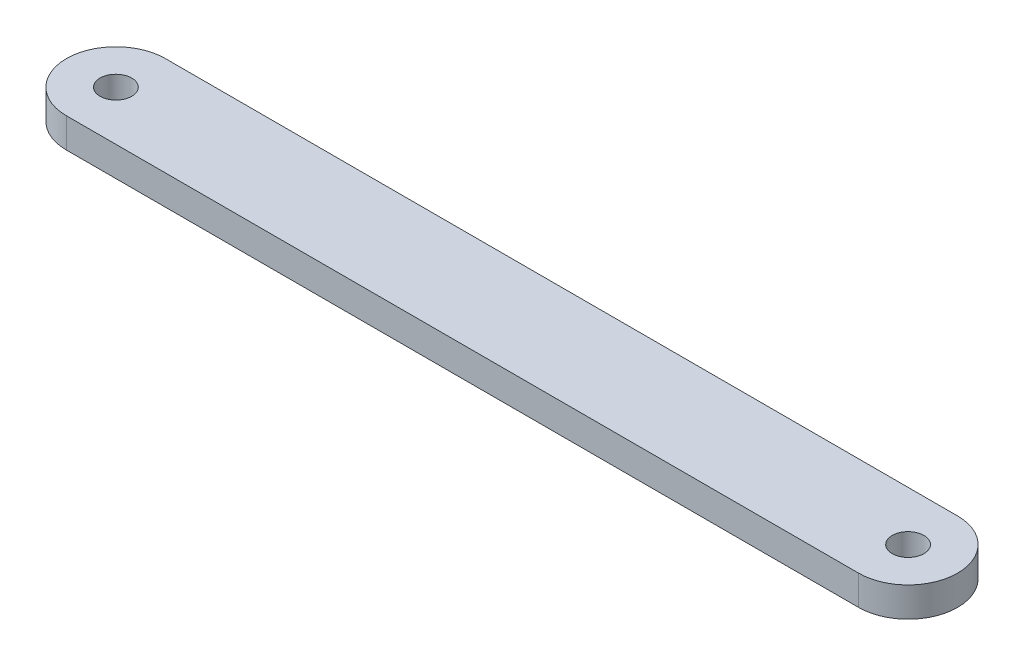
ISO-10303-21;
HEADER;
FILE_DESCRIPTION(('STEP AP214'),'2;1');
FILE_NAME('part.step','',(''),(''),'','','');
FILE_SCHEMA(('AUTOMOTIVE_DESIGN { 1 0 10303 214 1 1 1 1 }'));
ENDSEC;
DATA;
#1=APPLICATION_CONTEXT('core data for automotive mechanical design processes');
#2=APPLICATION_PROTOCOL_DEFINITION('international standard','automotive_design',2000,#1);
#3=PRODUCT_CONTEXT('',#1,'mechanical');
#4=PRODUCT('Part','Part','',(#3));
#5=PRODUCT_RELATED_PRODUCT_CATEGORY('part','',(#4));
#6=PRODUCT_DEFINITION_FORMATION('','',#4);
#7=PRODUCT_DEFINITION_CONTEXT('part definition',#1,'design');
#8=PRODUCT_DEFINITION('design','',#6,#7);
#9=PRODUCT_DEFINITION_SHAPE('','',#8);
#10=(LENGTH_UNIT() NAMED_UNIT(*) SI_UNIT(.MILLI.,.METRE.));
#11=(NAMED_UNIT(*) PLANE_ANGLE_UNIT() SI_UNIT($,.RADIAN.));
#12=(NAMED_UNIT(*) SI_UNIT($,.STERADIAN.) SOLID_ANGLE_UNIT());
#13=UNCERTAINTY_MEASURE_WITH_UNIT(LENGTH_MEASURE(1.E-05),#10,'distance_accuracy_value','');
#14=(GEOMETRIC_REPRESENTATION_CONTEXT(3) GLOBAL_UNCERTAINTY_ASSIGNED_CONTEXT((#13)) GLOBAL_UNIT_ASSIGNED_CONTEXT((#10,
#11,#12)) REPRESENTATION_CONTEXT('',''));
#15=CARTESIAN_POINT('',(0.,0.,0.));
#16=DIRECTION('',(0.,0.,1.));
#17=DIRECTION('',(1.,0.,0.));
#18=AXIS2_PLACEMENT_3D('',#15,#16,#17);
#19=CARTESIAN_POINT('',(80.,3.,0.));
#20=DIRECTION('',(0.,1.,0.));
#21=DIRECTION('',(0.,0.,1.));
#22=AXIS2_PLACEMENT_3D('',#19,#20,#21);
#23=PLANE('',#22);
#24=CARTESIAN_POINT('',(0.,3.,0.));
#25=DIRECTION('',(0.,1.,0.));
#26=DIRECTION('',(0.,0.,1.));
#27=AXIS2_PLACEMENT_3D('',#24,#25,#26);
#28=CIRCLE('',#27,1.6);
#29=CARTESIAN_POINT('',(0.,3.,1.6));
#30=VERTEX_POINT('',#29);
#31=EDGE_CURVE('E112',#30,#30,#28,.T.);
#32=ORIENTED_EDGE('',*,*,#31,.F.);
#33=EDGE_LOOP('',(#32));
#34=FACE_BOUND('',#33,.T.);
#35=CARTESIAN_POINT('',(80.,3.,0.));
#36=DIRECTION('',(0.,1.,0.));
#37=DIRECTION('',(0.,0.,1.));
#38=AXIS2_PLACEMENT_3D('',#35,#36,#37);
#39=CIRCLE('',#38,5.);
#40=CARTESIAN_POINT('',(80.,3.,5.));
#41=VERTEX_POINT('',#40);
#42=CARTESIAN_POINT('',(80.,3.,-5.));
#43=VERTEX_POINT('',#42);
#44=EDGE_CURVE('E92',#41,#43,#39,.T.);
#45=ORIENTED_EDGE('',*,*,#44,.T.);
#46=DIRECTION('',(-1.,0.,0.));
#47=VECTOR('',#46,1.);
#48=CARTESIAN_POINT('',(0.,3.,-5.));
#49=LINE('',#48,#47);
#50=CARTESIAN_POINT('',(0.,3.,-5.));
#51=VERTEX_POINT('',#50);
#52=EDGE_CURVE('E87',#43,#51,#49,.T.);
#53=ORIENTED_EDGE('',*,*,#52,.T.);
#54=CARTESIAN_POINT('',(0.,3.,0.));
#55=DIRECTION('',(0.,1.,0.));
#56=DIRECTION('',(0.,0.,1.));
#57=AXIS2_PLACEMENT_3D('',#54,#55,#56);
#58=CIRCLE('',#57,5.);
#59=CARTESIAN_POINT('',(0.,3.,5.));
#60=VERTEX_POINT('',#59);
#61=EDGE_CURVE('E90',#51,#60,#58,.T.);
#62=ORIENTED_EDGE('',*,*,#61,.T.);
#63=DIRECTION('',(1.,0.,0.));
#64=VECTOR('',#63,1.);
#65=CARTESIAN_POINT('',(0.,3.,5.));
#66=LINE('',#65,#64);
#67=EDGE_CURVE('E57',#60,#41,#66,.T.);
#68=ORIENTED_EDGE('',*,*,#67,.T.);
#69=EDGE_LOOP('',(#45,#53,#62,#68));
#70=FACE_BOUND('',#69,.T.);
#71=CARTESIAN_POINT('',(80.,3.,0.));
#72=DIRECTION('',(0.,1.,0.));
#73=DIRECTION('',(0.,0.,1.));
#74=AXIS2_PLACEMENT_3D('',#71,#72,#73);
#75=CIRCLE('',#74,1.60000000000001);
#76=CARTESIAN_POINT('',(80.,3.,1.60000000000001));
#77=VERTEX_POINT('',#76);
#78=EDGE_CURVE('E134',#77,#77,#75,.T.);
#79=ORIENTED_EDGE('',*,*,#78,.F.);
#80=EDGE_LOOP('',(#79));
#81=FACE_BOUND('',#80,.T.);
#82=ADVANCED_FACE('F39',(#34,#70,#81),#23,.T.);
#83=CARTESIAN_POINT('',(80.,0.,0.));
#84=DIRECTION('',(0.,1.,0.));
#85=DIRECTION('',(0.,0.,1.));
#86=AXIS2_PLACEMENT_3D('',#83,#84,#85);
#87=PLANE('',#86);
#88=CARTESIAN_POINT('',(80.,0.,0.));
#89=DIRECTION('',(0.,1.,0.));
#90=DIRECTION('',(0.,0.,1.));
#91=AXIS2_PLACEMENT_3D('',#88,#89,#90);
#92=CIRCLE('',#91,5.);
#93=CARTESIAN_POINT('',(80.,0.,5.));
#94=VERTEX_POINT('',#93);
#95=CARTESIAN_POINT('',(80.,0.,-5.));
#96=VERTEX_POINT('',#95);
#97=EDGE_CURVE('E108',#94,#96,#92,.T.);
#98=ORIENTED_EDGE('',*,*,#97,.F.);
#99=DIRECTION('',(1.,0.,0.));
#100=VECTOR('',#99,1.);
#101=CARTESIAN_POINT('',(0.,0.,5.));
#102=LINE('',#101,#100);
#103=CARTESIAN_POINT('',(0.,0.,5.));
#104=VERTEX_POINT('',#103);
#105=EDGE_CURVE('E80',#104,#94,#102,.T.);
#106=ORIENTED_EDGE('',*,*,#105,.F.);
#107=CARTESIAN_POINT('',(0.,0.,0.));
#108=DIRECTION('',(0.,1.,0.));
#109=DIRECTION('',(0.,0.,1.));
#110=AXIS2_PLACEMENT_3D('',#107,#108,#109);
#111=CIRCLE('',#110,5.);
#112=CARTESIAN_POINT('',(0.,0.,-5.));
#113=VERTEX_POINT('',#112);
#114=EDGE_CURVE('E74',#113,#104,#111,.T.);
#115=ORIENTED_EDGE('',*,*,#114,.F.);
#116=DIRECTION('',(-1.,0.,0.));
#117=VECTOR('',#116,1.);
#118=CARTESIAN_POINT('',(0.,0.,-5.));
#119=LINE('',#118,#117);
#120=EDGE_CURVE('E97',#96,#113,#119,.T.);
#121=ORIENTED_EDGE('',*,*,#120,.F.);
#122=EDGE_LOOP('',(#98,#106,#115,#121));
#123=FACE_BOUND('',#122,.T.);
#124=CARTESIAN_POINT('',(0.,0.,0.));
#125=DIRECTION('',(0.,1.,0.));
#126=DIRECTION('',(0.,0.,1.));
#127=AXIS2_PLACEMENT_3D('',#124,#125,#126);
#128=CIRCLE('',#127,1.6);
#129=CARTESIAN_POINT('',(0.,0.,1.6));
#130=VERTEX_POINT('',#129);
#131=EDGE_CURVE('E130',#130,#130,#128,.T.);
#132=ORIENTED_EDGE('',*,*,#131,.T.);
#133=EDGE_LOOP('',(#132));
#134=FACE_BOUND('',#133,.T.);
#135=CARTESIAN_POINT('',(80.,0.,0.));
#136=DIRECTION('',(0.,1.,0.));
#137=DIRECTION('',(0.,0.,1.));
#138=AXIS2_PLACEMENT_3D('',#135,#136,#137);
#139=CIRCLE('',#138,1.60000000000001);
#140=CARTESIAN_POINT('',(80.,0.,1.60000000000001));
#141=VERTEX_POINT('',#140);
#142=EDGE_CURVE('E138',#141,#141,#139,.T.);
#143=ORIENTED_EDGE('',*,*,#142,.T.);
#144=EDGE_LOOP('',(#143));
#145=FACE_BOUND('',#144,.T.);
#146=ADVANCED_FACE('F125',(#123,#134,#145),#87,.F.);
#147=CARTESIAN_POINT('',(80.,3.,0.));
#148=DIRECTION('',(0.,-1.,0.));
#149=DIRECTION('',(0.,0.,-1.));
#150=AXIS2_PLACEMENT_3D('',#147,#148,#149);
#151=CYLINDRICAL_SURFACE('',#150,5.);
#152=ORIENTED_EDGE('',*,*,#97,.T.);
#153=DIRECTION('',(0.,-1.,0.));
#154=VECTOR('',#153,1.);
#155=CARTESIAN_POINT('',(80.,3.,-5.));
#156=LINE('',#155,#154);
#157=EDGE_CURVE('E11',#43,#96,#156,.T.);
#158=ORIENTED_EDGE('',*,*,#157,.F.);
#159=ORIENTED_EDGE('',*,*,#44,.F.);
#160=DIRECTION('',(0.,-1.,0.));
#161=VECTOR('',#160,1.);
#162=CARTESIAN_POINT('',(80.,3.,5.));
#163=LINE('',#162,#161);
#164=EDGE_CURVE('E104',#41,#94,#163,.T.);
#165=ORIENTED_EDGE('',*,*,#164,.T.);
#166=EDGE_LOOP('',(#152,#158,#159,#165));
#167=FACE_BOUND('',#166,.T.);
#168=ADVANCED_FACE('F41',(#167),#151,.T.);
#169=CARTESIAN_POINT('',(0.,3.,-5.));
#170=DIRECTION('',(0.,0.,1.));
#171=DIRECTION('',(1.,0.,0.));
#172=AXIS2_PLACEMENT_3D('',#169,#170,#171);
#173=PLANE('',#172);
#174=ORIENTED_EDGE('',*,*,#120,.T.);
#175=DIRECTION('',(0.,-1.,0.));
#176=VECTOR('',#175,1.);
#177=CARTESIAN_POINT('',(0.,3.,-5.));
#178=LINE('',#177,#176);
#179=EDGE_CURVE('E49',#51,#113,#178,.T.);
#180=ORIENTED_EDGE('',*,*,#179,.F.);
#181=ORIENTED_EDGE('',*,*,#52,.F.);
#182=ORIENTED_EDGE('',*,*,#157,.T.);
#183=EDGE_LOOP('',(#174,#180,#181,#182));
#184=FACE_BOUND('',#183,.T.);
#185=ADVANCED_FACE('F96',(#184),#173,.F.);
#186=CARTESIAN_POINT('',(0.,3.,0.));
#187=DIRECTION('',(0.,-1.,0.));
#188=DIRECTION('',(0.,0.,-1.));
#189=AXIS2_PLACEMENT_3D('',#186,#187,#188);
#190=CYLINDRICAL_SURFACE('',#189,5.);
#191=ORIENTED_EDGE('',*,*,#114,.T.);
#192=DIRECTION('',(0.,-1.,0.));
#193=VECTOR('',#192,1.);
#194=CARTESIAN_POINT('',(0.,3.,5.));
#195=LINE('',#194,#193);
#196=EDGE_CURVE('E99',#60,#104,#195,.T.);
#197=ORIENTED_EDGE('',*,*,#196,.F.);
#198=ORIENTED_EDGE('',*,*,#61,.F.);
#199=ORIENTED_EDGE('',*,*,#179,.T.);
#200=EDGE_LOOP('',(#191,#197,#198,#199));
#201=FACE_BOUND('',#200,.T.);
#202=ADVANCED_FACE('F100',(#201),#190,.T.);
#203=CARTESIAN_POINT('',(0.,3.,5.));
#204=DIRECTION('',(0.,0.,-1.));
#205=DIRECTION('',(-1.,0.,0.));
#206=AXIS2_PLACEMENT_3D('',#203,#204,#205);
#207=PLANE('',#206);
#208=ORIENTED_EDGE('',*,*,#105,.T.);
#209=ORIENTED_EDGE('',*,*,#164,.F.);
#210=ORIENTED_EDGE('',*,*,#67,.F.);
#211=ORIENTED_EDGE('',*,*,#196,.T.);
#212=EDGE_LOOP('',(#208,#209,#210,#211));
#213=FACE_BOUND('',#212,.T.);
#214=ADVANCED_FACE('F122',(#213),#207,.F.);
#215=CARTESIAN_POINT('',(0.,3.,0.));
#216=DIRECTION('',(0.,-1.,0.));
#217=DIRECTION('',(0.,0.,-1.));
#218=AXIS2_PLACEMENT_3D('',#215,#216,#217);
#219=CYLINDRICAL_SURFACE('',#218,1.6);
#220=ORIENTED_EDGE('',*,*,#31,.T.);
#221=EDGE_LOOP('',(#220));
#222=FACE_BOUND('',#221,.T.);
#223=ORIENTED_EDGE('',*,*,#131,.F.);
#224=EDGE_LOOP('',(#223));
#225=FACE_BOUND('',#224,.T.);
#226=ADVANCED_FACE('F157',(#222,#225),#219,.F.);
#227=CARTESIAN_POINT('',(80.,3.,0.));
#228=DIRECTION('',(0.,-1.,0.));
#229=DIRECTION('',(0.,0.,-1.));
#230=AXIS2_PLACEMENT_3D('',#227,#228,#229);
#231=CYLINDRICAL_SURFACE('',#230,1.60000000000001);
#232=ORIENTED_EDGE('',*,*,#78,.T.);
#233=EDGE_LOOP('',(#232));
#234=FACE_BOUND('',#233,.T.);
#235=ORIENTED_EDGE('',*,*,#142,.F.);
#236=EDGE_LOOP('',(#235));
#237=FACE_BOUND('',#236,.T.);
#238=ADVANCED_FACE('F146',(#234,#237),#231,.F.);
#239=CLOSED_SHELL('',(#82,#146,#168,#185,#202,#214,#226,#238));
#240=MANIFOLD_SOLID_BREP('B2',#239);
#241=ADVANCED_BREP_SHAPE_REPRESENTATION('',(#18,#240),#14);
#242=SHAPE_DEFINITION_REPRESENTATION(#9,#241);
ENDSEC;
END-ISO-10303-21;
